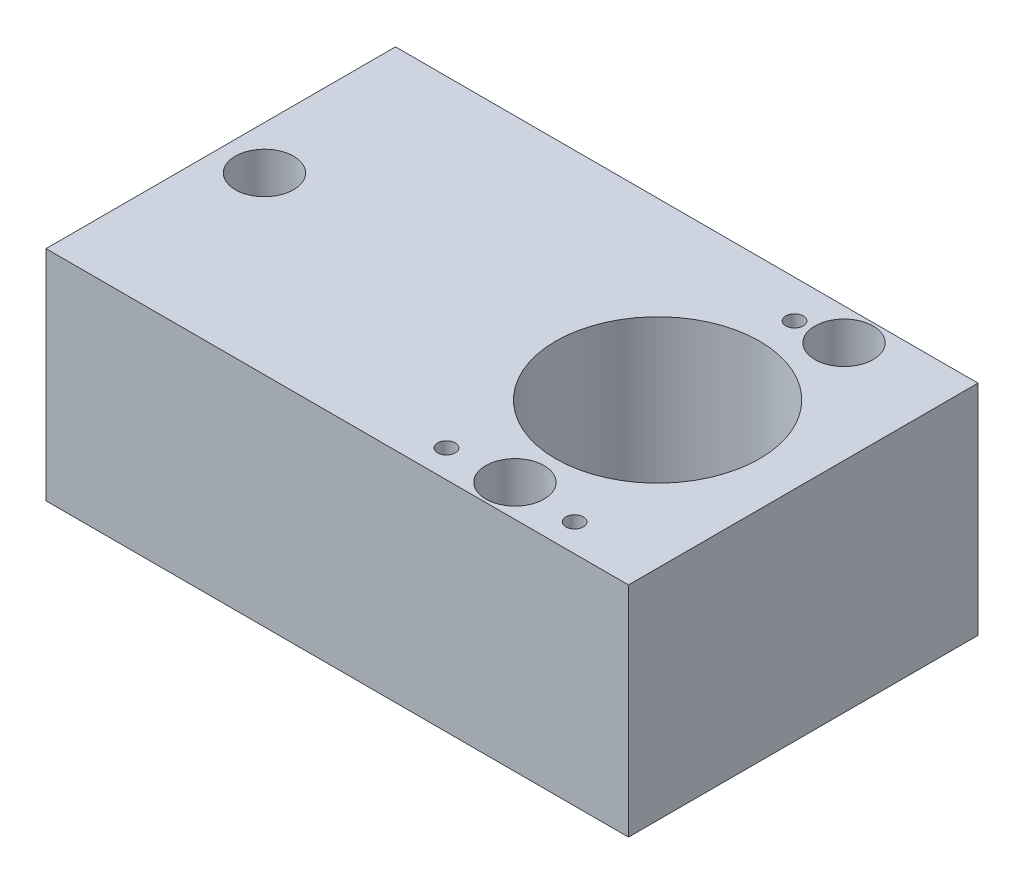
ISO-10303-21;
HEADER;
FILE_DESCRIPTION(('STEP AP214'),'2;1');
FILE_NAME('part.step','',(''),(''),'','','');
FILE_SCHEMA(('AUTOMOTIVE_DESIGN { 1 0 10303 214 1 1 1 1 }'));
ENDSEC;
DATA;
#1=APPLICATION_CONTEXT('core data for automotive mechanical design processes');
#2=APPLICATION_PROTOCOL_DEFINITION('international standard','automotive_design',2000,#1);
#3=PRODUCT_CONTEXT('',#1,'mechanical');
#4=PRODUCT('Part','Part','',(#3));
#5=PRODUCT_RELATED_PRODUCT_CATEGORY('part','',(#4));
#6=PRODUCT_DEFINITION_FORMATION('','',#4);
#7=PRODUCT_DEFINITION_CONTEXT('part definition',#1,'design');
#8=PRODUCT_DEFINITION('design','',#6,#7);
#9=PRODUCT_DEFINITION_SHAPE('','',#8);
#10=(LENGTH_UNIT() NAMED_UNIT(*) SI_UNIT(.MILLI.,.METRE.));
#11=(NAMED_UNIT(*) PLANE_ANGLE_UNIT() SI_UNIT($,.RADIAN.));
#12=(NAMED_UNIT(*) SI_UNIT($,.STERADIAN.) SOLID_ANGLE_UNIT());
#13=UNCERTAINTY_MEASURE_WITH_UNIT(LENGTH_MEASURE(1.E-05),#10,'distance_accuracy_value','');
#14=(GEOMETRIC_REPRESENTATION_CONTEXT(3) GLOBAL_UNCERTAINTY_ASSIGNED_CONTEXT((#13)) GLOBAL_UNIT_ASSIGNED_CONTEXT((#10,
#11,#12)) REPRESENTATION_CONTEXT('',''));
#15=CARTESIAN_POINT('',(0.,0.,0.));
#16=DIRECTION('',(0.,0.,1.));
#17=DIRECTION('',(1.,0.,0.));
#18=AXIS2_PLACEMENT_3D('',#15,#16,#17);
#19=CARTESIAN_POINT('',(0.,2.5,0.));
#20=DIRECTION('',(0.,-1.,0.));
#21=DIRECTION('',(0.,0.,-1.));
#22=AXIS2_PLACEMENT_3D('',#19,#20,#21);
#23=PLANE('',#22);
#24=CARTESIAN_POINT('',(15.,2.5,6.));
#25=DIRECTION('',(0.,1.,0.));
#26=DIRECTION('',(0.,0.,1.));
#27=AXIS2_PLACEMENT_3D('',#24,#25,#26);
#28=CIRCLE('',#27,2.55);
#29=CARTESIAN_POINT('',(15.,2.5,8.55));
#30=VERTEX_POINT('',#29);
#31=EDGE_CURVE('E131',#30,#30,#28,.T.);
#32=ORIENTED_EDGE('',*,*,#31,.F.);
#33=EDGE_LOOP('',(#32));
#34=FACE_BOUND('',#33,.T.);
#35=CARTESIAN_POINT('',(15.,2.5,6.));
#36=DIRECTION('',(0.,-1.,0.));
#37=DIRECTION('',(0.,0.,-1.));
#38=AXIS2_PLACEMENT_3D('',#35,#36,#37);
#39=CIRCLE('',#38,3.5);
#40=CARTESIAN_POINT('',(15.,2.5,2.5));
#41=VERTEX_POINT('',#40);
#42=EDGE_CURVE('E13',#41,#41,#39,.T.);
#43=ORIENTED_EDGE('',*,*,#42,.F.);
#44=EDGE_LOOP('',(#43));
#45=FACE_BOUND('',#44,.T.);
#46=ADVANCED_FACE('F54',(#34,#45),#23,.F.);
#47=CARTESIAN_POINT('',(0.,2.5,0.));
#48=DIRECTION('',(0.,0.,-1.));
#49=DIRECTION('',(-1.,0.,0.));
#50=AXIS2_PLACEMENT_3D('',#47,#48,#49);
#51=PLANE('',#50);
#52=DIRECTION('',(1.,0.,0.));
#53=VECTOR('',#52,1.);
#54=CARTESIAN_POINT('',(0.,0.,0.));
#55=LINE('',#54,#53);
#56=CARTESIAN_POINT('',(0.,0.,0.));
#57=VERTEX_POINT('',#56);
#58=CARTESIAN_POINT('',(20.,0.,0.));
#59=VERTEX_POINT('',#58);
#60=EDGE_CURVE('E144',#57,#59,#55,.T.);
#61=ORIENTED_EDGE('',*,*,#60,.F.);
#62=DIRECTION('',(0.,-1.,0.));
#63=VECTOR('',#62,1.);
#64=CARTESIAN_POINT('',(0.,2.5,0.));
#65=LINE('',#64,#63);
#66=CARTESIAN_POINT('',(0.,7.5,0.));
#67=VERTEX_POINT('',#66);
#68=EDGE_CURVE('E63',#67,#57,#65,.T.);
#69=ORIENTED_EDGE('',*,*,#68,.F.);
#70=DIRECTION('',(1.,0.,0.));
#71=VECTOR('',#70,1.);
#72=CARTESIAN_POINT('',(0.,7.5,0.));
#73=LINE('',#72,#71);
#74=CARTESIAN_POINT('',(20.,7.5,0.));
#75=VERTEX_POINT('',#74);
#76=EDGE_CURVE('E124',#67,#75,#73,.T.);
#77=ORIENTED_EDGE('',*,*,#76,.T.);
#78=DIRECTION('',(0.,-1.,0.));
#79=VECTOR('',#78,1.);
#80=CARTESIAN_POINT('',(20.,2.5,0.));
#81=LINE('',#80,#79);
#82=EDGE_CURVE('E105',#75,#59,#81,.T.);
#83=ORIENTED_EDGE('',*,*,#82,.T.);
#84=EDGE_LOOP('',(#61,#69,#77,#83));
#85=FACE_BOUND('',#84,.T.);
#86=ADVANCED_FACE('F56',(#85),#51,.T.);
#87=CARTESIAN_POINT('',(0.,2.5,0.));
#88=DIRECTION('',(1.,0.,0.));
#89=DIRECTION('',(0.,0.,-1.));
#90=AXIS2_PLACEMENT_3D('',#87,#88,#89);
#91=PLANE('',#90);
#92=DIRECTION('',(0.,0.,1.));
#93=VECTOR('',#92,1.);
#94=CARTESIAN_POINT('',(0.,0.,0.));
#95=LINE('',#94,#93);
#96=CARTESIAN_POINT('',(0.,0.,12.));
#97=VERTEX_POINT('',#96);
#98=EDGE_CURVE('E74',#57,#97,#95,.T.);
#99=ORIENTED_EDGE('',*,*,#98,.T.);
#100=DIRECTION('',(0.,-1.,0.));
#101=VECTOR('',#100,1.);
#102=CARTESIAN_POINT('',(0.,2.5,12.));
#103=LINE('',#102,#101);
#104=CARTESIAN_POINT('',(0.,7.5,12.));
#105=VERTEX_POINT('',#104);
#106=EDGE_CURVE('E104',#105,#97,#103,.T.);
#107=ORIENTED_EDGE('',*,*,#106,.F.);
#108=DIRECTION('',(0.,0.,1.));
#109=VECTOR('',#108,1.);
#110=CARTESIAN_POINT('',(0.,7.5,0.));
#111=LINE('',#110,#109);
#112=EDGE_CURVE('E114',#67,#105,#111,.T.);
#113=ORIENTED_EDGE('',*,*,#112,.F.);
#114=ORIENTED_EDGE('',*,*,#68,.T.);
#115=EDGE_LOOP('',(#99,#107,#113,#114));
#116=FACE_BOUND('',#115,.T.);
#117=ADVANCED_FACE('F249',(#116),#91,.F.);
#118=CARTESIAN_POINT('',(0.,2.5,12.));
#119=DIRECTION('',(0.,0.,-1.));
#120=DIRECTION('',(-1.,0.,0.));
#121=AXIS2_PLACEMENT_3D('',#118,#119,#120);
#122=PLANE('',#121);
#123=DIRECTION('',(1.,0.,0.));
#124=VECTOR('',#123,1.);
#125=CARTESIAN_POINT('',(0.,0.,12.));
#126=LINE('',#125,#124);
#127=CARTESIAN_POINT('',(20.,0.,12.));
#128=VERTEX_POINT('',#127);
#129=EDGE_CURVE('E99',#97,#128,#126,.T.);
#130=ORIENTED_EDGE('',*,*,#129,.T.);
#131=DIRECTION('',(0.,-1.,0.));
#132=VECTOR('',#131,1.);
#133=CARTESIAN_POINT('',(20.,2.5,12.));
#134=LINE('',#133,#132);
#135=CARTESIAN_POINT('',(20.,7.5,12.));
#136=VERTEX_POINT('',#135);
#137=EDGE_CURVE('E94',#136,#128,#134,.T.);
#138=ORIENTED_EDGE('',*,*,#137,.F.);
#139=DIRECTION('',(1.,0.,0.));
#140=VECTOR('',#139,1.);
#141=CARTESIAN_POINT('',(0.,7.5,12.));
#142=LINE('',#141,#140);
#143=EDGE_CURVE('E97',#105,#136,#142,.T.);
#144=ORIENTED_EDGE('',*,*,#143,.F.);
#145=ORIENTED_EDGE('',*,*,#106,.T.);
#146=EDGE_LOOP('',(#130,#138,#144,#145));
#147=FACE_BOUND('',#146,.T.);
#148=ADVANCED_FACE('F96',(#147),#122,.F.);
#149=CARTESIAN_POINT('',(20.,2.5,0.));
#150=DIRECTION('',(1.,0.,0.));
#151=DIRECTION('',(0.,0.,-1.));
#152=AXIS2_PLACEMENT_3D('',#149,#150,#151);
#153=PLANE('',#152);
#154=DIRECTION('',(0.,0.,1.));
#155=VECTOR('',#154,1.);
#156=CARTESIAN_POINT('',(20.,0.,0.));
#157=LINE('',#156,#155);
#158=EDGE_CURVE('E147',#59,#128,#157,.T.);
#159=ORIENTED_EDGE('',*,*,#158,.F.);
#160=ORIENTED_EDGE('',*,*,#82,.F.);
#161=DIRECTION('',(0.,0.,1.));
#162=VECTOR('',#161,1.);
#163=CARTESIAN_POINT('',(20.,7.5,0.));
#164=LINE('',#163,#162);
#165=EDGE_CURVE('E112',#75,#136,#164,.T.);
#166=ORIENTED_EDGE('',*,*,#165,.T.);
#167=ORIENTED_EDGE('',*,*,#137,.T.);
#168=EDGE_LOOP('',(#159,#160,#166,#167));
#169=FACE_BOUND('',#168,.T.);
#170=ADVANCED_FACE('F116',(#169),#153,.T.);
#171=CARTESIAN_POINT('',(0.,0.,0.));
#172=DIRECTION('',(0.,-1.,0.));
#173=DIRECTION('',(0.,0.,-1.));
#174=AXIS2_PLACEMENT_3D('',#171,#172,#173);
#175=PLANE('',#174);
#176=CARTESIAN_POINT('',(15.,0.,10.9));
#177=DIRECTION('',(0.,-1.,0.));
#178=DIRECTION('',(0.,0.,-1.));
#179=AXIS2_PLACEMENT_3D('',#176,#177,#178);
#180=CIRCLE('',#179,0.699999999999998);
#181=CARTESIAN_POINT('',(15.,0.,10.2));
#182=VERTEX_POINT('',#181);
#183=EDGE_CURVE('E120',#182,#182,#180,.T.);
#184=ORIENTED_EDGE('',*,*,#183,.F.);
#185=EDGE_LOOP('',(#184));
#186=FACE_BOUND('',#185,.T.);
#187=CARTESIAN_POINT('',(16.5,0.,1.1));
#188=DIRECTION('',(0.,-1.,0.));
#189=DIRECTION('',(0.,0.,-1.));
#190=AXIS2_PLACEMENT_3D('',#187,#188,#189);
#191=CIRCLE('',#190,0.699999999999998);
#192=CARTESIAN_POINT('',(16.5,0.,0.400000000000002));
#193=VERTEX_POINT('',#192);
#194=EDGE_CURVE('E166',#193,#193,#191,.T.);
#195=ORIENTED_EDGE('',*,*,#194,.F.);
#196=EDGE_LOOP('',(#195));
#197=FACE_BOUND('',#196,.T.);
#198=CARTESIAN_POINT('',(1.5,0.,6.));
#199=DIRECTION('',(0.,-1.,0.));
#200=DIRECTION('',(0.,0.,-1.));
#201=AXIS2_PLACEMENT_3D('',#198,#199,#200);
#202=CIRCLE('',#201,0.699999999999998);
#203=CARTESIAN_POINT('',(1.5,0.,5.3));
#204=VERTEX_POINT('',#203);
#205=EDGE_CURVE('E162',#204,#204,#202,.T.);
#206=ORIENTED_EDGE('',*,*,#205,.F.);
#207=EDGE_LOOP('',(#206));
#208=FACE_BOUND('',#207,.T.);
#209=CARTESIAN_POINT('',(8.34065861769801,0.,8.2));
#210=DIRECTION('',(0.,1.,0.));
#211=DIRECTION('',(0.,0.,1.));
#212=AXIS2_PLACEMENT_3D('',#209,#210,#211);
#213=CIRCLE('',#212,0.55);
#214=CARTESIAN_POINT('',(8.34065861769801,0.,8.75));
#215=VERTEX_POINT('',#214);
#216=EDGE_CURVE('E134',#215,#215,#213,.T.);
#217=ORIENTED_EDGE('',*,*,#216,.T.);
#218=EDGE_LOOP('',(#217));
#219=FACE_BOUND('',#218,.T.);
#220=CARTESIAN_POINT('',(15.,0.,6.));
#221=DIRECTION('',(0.,1.,0.));
#222=DIRECTION('',(0.,0.,1.));
#223=AXIS2_PLACEMENT_3D('',#220,#221,#222);
#224=CIRCLE('',#223,2.55);
#225=CARTESIAN_POINT('',(15.,0.,8.55));
#226=VERTEX_POINT('',#225);
#227=EDGE_CURVE('E127',#226,#226,#224,.T.);
#228=ORIENTED_EDGE('',*,*,#227,.T.);
#229=EDGE_LOOP('',(#228));
#230=FACE_BOUND('',#229,.T.);
#231=CARTESIAN_POINT('',(10.7298585496743,0.,3.80776552481034));
#232=DIRECTION('',(0.,1.,0.));
#233=DIRECTION('',(0.,0.,1.));
#234=AXIS2_PLACEMENT_3D('',#231,#232,#233);
#235=CIRCLE('',#234,0.55);
#236=CARTESIAN_POINT('',(10.7298585496743,0.,4.35776552481034));
#237=VERTEX_POINT('',#236);
#238=EDGE_CURVE('E130',#237,#237,#235,.T.);
#239=ORIENTED_EDGE('',*,*,#238,.T.);
#240=EDGE_LOOP('',(#239));
#241=FACE_BOUND('',#240,.T.);
#242=ORIENTED_EDGE('',*,*,#60,.T.);
#243=ORIENTED_EDGE('',*,*,#158,.T.);
#244=ORIENTED_EDGE('',*,*,#129,.F.);
#245=ORIENTED_EDGE('',*,*,#98,.F.);
#246=EDGE_LOOP('',(#242,#243,#244,#245));
#247=FACE_BOUND('',#246,.T.);
#248=ADVANCED_FACE('F256',(#186,#197,#208,#219,#230,#241,#247),#175,.T.);
#249=CARTESIAN_POINT('',(10.7298585496743,2.5,3.80776552481034));
#250=DIRECTION('',(0.,-1.,0.));
#251=DIRECTION('',(0.,0.,-1.));
#252=AXIS2_PLACEMENT_3D('',#249,#250,#251);
#253=CYLINDRICAL_SURFACE('',#252,0.55);
#254=CARTESIAN_POINT('',(10.7298585496743,2.5,3.80776552481034));
#255=DIRECTION('',(0.,1.,0.));
#256=DIRECTION('',(0.,0.,1.));
#257=AXIS2_PLACEMENT_3D('',#254,#255,#256);
#258=CIRCLE('',#257,0.55);
#259=CARTESIAN_POINT('',(10.7298585496743,2.5,4.35776552481034));
#260=VERTEX_POINT('',#259);
#261=EDGE_CURVE('E126',#260,#260,#258,.T.);
#262=ORIENTED_EDGE('',*,*,#261,.T.);
#263=EDGE_LOOP('',(#262));
#264=FACE_BOUND('',#263,.T.);
#265=ORIENTED_EDGE('',*,*,#238,.F.);
#266=EDGE_LOOP('',(#265));
#267=FACE_BOUND('',#266,.T.);
#268=ADVANCED_FACE('F254',(#264,#267),#253,.F.);
#269=CARTESIAN_POINT('',(15.,2.5,6.));
#270=DIRECTION('',(0.,-1.,0.));
#271=DIRECTION('',(0.,0.,-1.));
#272=AXIS2_PLACEMENT_3D('',#269,#270,#271);
#273=CYLINDRICAL_SURFACE('',#272,2.55);
#274=ORIENTED_EDGE('',*,*,#31,.T.);
#275=EDGE_LOOP('',(#274));
#276=FACE_BOUND('',#275,.T.);
#277=ORIENTED_EDGE('',*,*,#227,.F.);
#278=EDGE_LOOP('',(#277));
#279=FACE_BOUND('',#278,.T.);
#280=ADVANCED_FACE('F281',(#276,#279),#273,.F.);
#281=CARTESIAN_POINT('',(8.34065861769801,2.5,8.2));
#282=DIRECTION('',(0.,-1.,0.));
#283=DIRECTION('',(0.,0.,-1.));
#284=AXIS2_PLACEMENT_3D('',#281,#282,#283);
#285=CYLINDRICAL_SURFACE('',#284,0.55);
#286=CARTESIAN_POINT('',(8.34065861769801,2.5,8.2));
#287=DIRECTION('',(0.,1.,0.));
#288=DIRECTION('',(0.,0.,1.));
#289=AXIS2_PLACEMENT_3D('',#286,#287,#288);
#290=CIRCLE('',#289,0.55);
#291=CARTESIAN_POINT('',(8.34065861769801,2.5,8.75));
#292=VERTEX_POINT('',#291);
#293=EDGE_CURVE('E137',#292,#292,#290,.T.);
#294=ORIENTED_EDGE('',*,*,#293,.T.);
#295=EDGE_LOOP('',(#294));
#296=FACE_BOUND('',#295,.T.);
#297=ORIENTED_EDGE('',*,*,#216,.F.);
#298=EDGE_LOOP('',(#297));
#299=FACE_BOUND('',#298,.T.);
#300=ADVANCED_FACE('F239',(#296,#299),#285,.F.);
#301=CARTESIAN_POINT('',(15.,7.5,6.));
#302=DIRECTION('',(0.,-1.,0.));
#303=DIRECTION('',(0.,0.,-1.));
#304=AXIS2_PLACEMENT_3D('',#301,#302,#303);
#305=CYLINDRICAL_SURFACE('',#304,3.5);
#306=CARTESIAN_POINT('',(15.,7.5,6.));
#307=DIRECTION('',(0.,-1.,0.));
#308=DIRECTION('',(0.,0.,-1.));
#309=AXIS2_PLACEMENT_3D('',#306,#307,#308);
#310=CIRCLE('',#309,3.5);
#311=CARTESIAN_POINT('',(15.,7.5,2.5));
#312=VERTEX_POINT('',#311);
#313=EDGE_CURVE('E117',#312,#312,#310,.T.);
#314=ORIENTED_EDGE('',*,*,#313,.F.);
#315=EDGE_LOOP('',(#314));
#316=FACE_BOUND('',#315,.T.);
#317=ORIENTED_EDGE('',*,*,#42,.T.);
#318=EDGE_LOOP('',(#317));
#319=FACE_BOUND('',#318,.T.);
#320=ADVANCED_FACE('F223',(#316,#319),#305,.F.);
#321=CARTESIAN_POINT('',(0.,7.5,0.));
#322=DIRECTION('',(0.,1.,0.));
#323=DIRECTION('',(0.,0.,1.));
#324=AXIS2_PLACEMENT_3D('',#321,#322,#323);
#325=PLANE('',#324);
#326=CARTESIAN_POINT('',(12.8,7.5,11.05));
#327=DIRECTION('',(0.,1.,0.));
#328=DIRECTION('',(0.,0.,1.));
#329=AXIS2_PLACEMENT_3D('',#326,#327,#328);
#330=CIRCLE('',#329,0.3);
#331=CARTESIAN_POINT('',(12.8,7.5,11.35));
#332=VERTEX_POINT('',#331);
#333=EDGE_CURVE('E205',#332,#332,#330,.T.);
#334=ORIENTED_EDGE('',*,*,#333,.F.);
#335=EDGE_LOOP('',(#334));
#336=FACE_BOUND('',#335,.T.);
#337=CARTESIAN_POINT('',(17.2,7.5,11.05));
#338=DIRECTION('',(0.,1.,0.));
#339=DIRECTION('',(0.,0.,1.));
#340=AXIS2_PLACEMENT_3D('',#337,#338,#339);
#341=CIRCLE('',#340,0.299999999999997);
#342=CARTESIAN_POINT('',(17.2,7.5,11.35));
#343=VERTEX_POINT('',#342);
#344=EDGE_CURVE('E202',#343,#343,#341,.T.);
#345=ORIENTED_EDGE('',*,*,#344,.F.);
#346=EDGE_LOOP('',(#345));
#347=FACE_BOUND('',#346,.T.);
#348=CARTESIAN_POINT('',(15.,7.5,1.3));
#349=DIRECTION('',(0.,1.,0.));
#350=DIRECTION('',(0.,0.,1.));
#351=AXIS2_PLACEMENT_3D('',#348,#349,#350);
#352=CIRCLE('',#351,0.3);
#353=CARTESIAN_POINT('',(15.,7.5,1.6));
#354=VERTEX_POINT('',#353);
#355=EDGE_CURVE('E196',#354,#354,#352,.T.);
#356=ORIENTED_EDGE('',*,*,#355,.F.);
#357=EDGE_LOOP('',(#356));
#358=FACE_BOUND('',#357,.T.);
#359=CARTESIAN_POINT('',(15.,7.5,10.9));
#360=DIRECTION('',(0.,1.,0.));
#361=DIRECTION('',(0.,0.,1.));
#362=AXIS2_PLACEMENT_3D('',#359,#360,#361);
#363=CIRCLE('',#362,1.);
#364=CARTESIAN_POINT('',(15.,7.5,11.9));
#365=VERTEX_POINT('',#364);
#366=EDGE_CURVE('E186',#365,#365,#363,.T.);
#367=ORIENTED_EDGE('',*,*,#366,.F.);
#368=EDGE_LOOP('',(#367));
#369=FACE_BOUND('',#368,.T.);
#370=CARTESIAN_POINT('',(1.5,7.5,6.));
#371=DIRECTION('',(0.,1.,0.));
#372=DIRECTION('',(0.,0.,1.));
#373=AXIS2_PLACEMENT_3D('',#370,#371,#372);
#374=CIRCLE('',#373,1.);
#375=CARTESIAN_POINT('',(1.5,7.5,7.));
#376=VERTEX_POINT('',#375);
#377=EDGE_CURVE('E183',#376,#376,#374,.T.);
#378=ORIENTED_EDGE('',*,*,#377,.F.);
#379=EDGE_LOOP('',(#378));
#380=FACE_BOUND('',#379,.T.);
#381=CARTESIAN_POINT('',(16.5,7.5,1.1));
#382=DIRECTION('',(0.,1.,0.));
#383=DIRECTION('',(0.,0.,1.));
#384=AXIS2_PLACEMENT_3D('',#381,#382,#383);
#385=CIRCLE('',#384,1.);
#386=CARTESIAN_POINT('',(16.5,7.5,2.1));
#387=VERTEX_POINT('',#386);
#388=EDGE_CURVE('E175',#387,#387,#385,.T.);
#389=ORIENTED_EDGE('',*,*,#388,.F.);
#390=EDGE_LOOP('',(#389));
#391=FACE_BOUND('',#390,.T.);
#392=ORIENTED_EDGE('',*,*,#313,.T.);
#393=EDGE_LOOP('',(#392));
#394=FACE_BOUND('',#393,.T.);
#395=ORIENTED_EDGE('',*,*,#165,.F.);
#396=ORIENTED_EDGE('',*,*,#76,.F.);
#397=ORIENTED_EDGE('',*,*,#112,.T.);
#398=ORIENTED_EDGE('',*,*,#143,.T.);
#399=EDGE_LOOP('',(#395,#396,#397,#398));
#400=FACE_BOUND('',#399,.T.);
#401=ADVANCED_FACE('F110',(#336,#347,#358,#369,#380,#391,#394,#400),#325,.T.);
#402=CARTESIAN_POINT('',(0.,2.5,0.));
#403=DIRECTION('',(0.,1.,0.));
#404=DIRECTION('',(0.,0.,1.));
#405=AXIS2_PLACEMENT_3D('',#402,#403,#404);
#406=PLANE('',#405);
#407=ORIENTED_EDGE('',*,*,#261,.F.);
#408=EDGE_LOOP('',(#407));
#409=FACE_BOUND('',#408,.T.);
#410=ADVANCED_FACE('F222',(#409),#406,.F.);
#411=ORIENTED_EDGE('',*,*,#293,.F.);
#412=EDGE_LOOP('',(#411));
#413=FACE_BOUND('',#412,.T.);
#414=ADVANCED_FACE('F310',(#413),#406,.F.);
#415=CARTESIAN_POINT('',(1.5,7.5,6.));
#416=DIRECTION('',(0.,-1.,0.));
#417=DIRECTION('',(0.,0.,-1.));
#418=AXIS2_PLACEMENT_3D('',#415,#416,#417);
#419=CYLINDRICAL_SURFACE('',#418,0.699999999999998);
#420=CARTESIAN_POINT('',(1.5,2.,6.));
#421=DIRECTION('',(0.,-1.,0.));
#422=DIRECTION('',(0.,0.,-1.));
#423=AXIS2_PLACEMENT_3D('',#420,#421,#422);
#424=CIRCLE('',#423,0.699999999999998);
#425=CARTESIAN_POINT('',(1.5,2.,5.3));
#426=VERTEX_POINT('',#425);
#427=EDGE_CURVE('E58',#426,#426,#424,.F.);
#428=ORIENTED_EDGE('',*,*,#427,.T.);
#429=EDGE_LOOP('',(#428));
#430=FACE_BOUND('',#429,.T.);
#431=ORIENTED_EDGE('',*,*,#205,.T.);
#432=EDGE_LOOP('',(#431));
#433=FACE_BOUND('',#432,.T.);
#434=ADVANCED_FACE('F317',(#430,#433),#419,.F.);
#435=CARTESIAN_POINT('',(16.5,7.5,1.1));
#436=DIRECTION('',(0.,-1.,0.));
#437=DIRECTION('',(0.,0.,-1.));
#438=AXIS2_PLACEMENT_3D('',#435,#436,#437);
#439=CYLINDRICAL_SURFACE('',#438,0.699999999999998);
#440=CARTESIAN_POINT('',(16.5,2.,1.1));
#441=DIRECTION('',(0.,-1.,0.));
#442=DIRECTION('',(0.,0.,-1.));
#443=AXIS2_PLACEMENT_3D('',#440,#441,#442);
#444=CIRCLE('',#443,0.699999999999998);
#445=CARTESIAN_POINT('',(16.5,2.,0.400000000000002));
#446=VERTEX_POINT('',#445);
#447=EDGE_CURVE('E156',#446,#446,#444,.F.);
#448=ORIENTED_EDGE('',*,*,#447,.T.);
#449=EDGE_LOOP('',(#448));
#450=FACE_BOUND('',#449,.T.);
#451=ORIENTED_EDGE('',*,*,#194,.T.);
#452=EDGE_LOOP('',(#451));
#453=FACE_BOUND('',#452,.T.);
#454=ADVANCED_FACE('F323',(#450,#453),#439,.F.);
#455=CARTESIAN_POINT('',(15.,7.5,10.9));
#456=DIRECTION('',(0.,-1.,0.));
#457=DIRECTION('',(0.,0.,-1.));
#458=AXIS2_PLACEMENT_3D('',#455,#456,#457);
#459=CYLINDRICAL_SURFACE('',#458,0.699999999999998);
#460=CARTESIAN_POINT('',(15.,2.,10.9));
#461=DIRECTION('',(0.,-1.,0.));
#462=DIRECTION('',(0.,0.,-1.));
#463=AXIS2_PLACEMENT_3D('',#460,#461,#462);
#464=CIRCLE('',#463,0.699999999999998);
#465=CARTESIAN_POINT('',(15.,2.,10.2));
#466=VERTEX_POINT('',#465);
#467=EDGE_CURVE('E154',#466,#466,#464,.F.);
#468=ORIENTED_EDGE('',*,*,#467,.T.);
#469=EDGE_LOOP('',(#468));
#470=FACE_BOUND('',#469,.T.);
#471=ORIENTED_EDGE('',*,*,#183,.T.);
#472=EDGE_LOOP('',(#471));
#473=FACE_BOUND('',#472,.T.);
#474=ADVANCED_FACE('F330',(#470,#473),#459,.F.);
#475=CARTESIAN_POINT('',(0.,2.,0.));
#476=DIRECTION('',(0.,-1.,0.));
#477=DIRECTION('',(0.,0.,-1.));
#478=AXIS2_PLACEMENT_3D('',#475,#476,#477);
#479=PLANE('',#478);
#480=CARTESIAN_POINT('',(15.,2.,10.9));
#481=DIRECTION('',(0.,-1.,0.));
#482=DIRECTION('',(0.,0.,-1.));
#483=AXIS2_PLACEMENT_3D('',#480,#481,#482);
#484=CIRCLE('',#483,1.);
#485=CARTESIAN_POINT('',(15.,2.,9.9));
#486=VERTEX_POINT('',#485);
#487=EDGE_CURVE('E157',#486,#486,#484,.F.);
#488=ORIENTED_EDGE('',*,*,#487,.T.);
#489=EDGE_LOOP('',(#488));
#490=FACE_BOUND('',#489,.T.);
#491=ORIENTED_EDGE('',*,*,#467,.F.);
#492=EDGE_LOOP('',(#491));
#493=FACE_BOUND('',#492,.T.);
#494=ADVANCED_FACE('F337',(#490,#493),#479,.F.);
#495=CARTESIAN_POINT('',(15.,-2.8284271247462,10.9));
#496=DIRECTION('',(0.,1.,0.));
#497=DIRECTION('',(0.,0.,1.));
#498=AXIS2_PLACEMENT_3D('',#495,#496,#497);
#499=CYLINDRICAL_SURFACE('',#498,1.);
#500=ORIENTED_EDGE('',*,*,#366,.T.);
#501=EDGE_LOOP('',(#500));
#502=FACE_BOUND('',#501,.T.);
#503=ORIENTED_EDGE('',*,*,#487,.F.);
#504=EDGE_LOOP('',(#503));
#505=FACE_BOUND('',#504,.T.);
#506=ADVANCED_FACE('F345',(#502,#505),#499,.F.);
#507=CARTESIAN_POINT('',(0.,2.,0.));
#508=DIRECTION('',(0.,-1.,0.));
#509=DIRECTION('',(0.,0.,-1.));
#510=AXIS2_PLACEMENT_3D('',#507,#508,#509);
#511=PLANE('',#510);
#512=CARTESIAN_POINT('',(16.5,2.,1.1));
#513=DIRECTION('',(0.,-1.,0.));
#514=DIRECTION('',(0.,0.,-1.));
#515=AXIS2_PLACEMENT_3D('',#512,#513,#514);
#516=CIRCLE('',#515,1.);
#517=CARTESIAN_POINT('',(16.5,2.,0.0999999999999987));
#518=VERTEX_POINT('',#517);
#519=EDGE_CURVE('E179',#518,#518,#516,.F.);
#520=ORIENTED_EDGE('',*,*,#519,.T.);
#521=EDGE_LOOP('',(#520));
#522=FACE_BOUND('',#521,.T.);
#523=ORIENTED_EDGE('',*,*,#447,.F.);
#524=EDGE_LOOP('',(#523));
#525=FACE_BOUND('',#524,.T.);
#526=ADVANCED_FACE('F353',(#522,#525),#511,.F.);
#527=CARTESIAN_POINT('',(16.5,-2.8284271247462,1.1));
#528=DIRECTION('',(0.,1.,0.));
#529=DIRECTION('',(0.,0.,1.));
#530=AXIS2_PLACEMENT_3D('',#527,#528,#529);
#531=CYLINDRICAL_SURFACE('',#530,1.);
#532=ORIENTED_EDGE('',*,*,#388,.T.);
#533=EDGE_LOOP('',(#532));
#534=FACE_BOUND('',#533,.T.);
#535=ORIENTED_EDGE('',*,*,#519,.F.);
#536=EDGE_LOOP('',(#535));
#537=FACE_BOUND('',#536,.T.);
#538=ADVANCED_FACE('F361',(#534,#537),#531,.F.);
#539=CARTESIAN_POINT('',(0.,2.,0.));
#540=DIRECTION('',(0.,-1.,0.));
#541=DIRECTION('',(0.,0.,-1.));
#542=AXIS2_PLACEMENT_3D('',#539,#540,#541);
#543=PLANE('',#542);
#544=CARTESIAN_POINT('',(1.5,2.,6.));
#545=DIRECTION('',(0.,-1.,0.));
#546=DIRECTION('',(0.,0.,-1.));
#547=AXIS2_PLACEMENT_3D('',#544,#545,#546);
#548=CIRCLE('',#547,1.);
#549=CARTESIAN_POINT('',(1.5,2.,5.));
#550=VERTEX_POINT('',#549);
#551=EDGE_CURVE('E178',#550,#550,#548,.F.);
#552=ORIENTED_EDGE('',*,*,#551,.T.);
#553=EDGE_LOOP('',(#552));
#554=FACE_BOUND('',#553,.T.);
#555=ORIENTED_EDGE('',*,*,#427,.F.);
#556=EDGE_LOOP('',(#555));
#557=FACE_BOUND('',#556,.T.);
#558=ADVANCED_FACE('F369',(#554,#557),#543,.F.);
#559=CARTESIAN_POINT('',(1.5,-2.8284271247462,6.));
#560=DIRECTION('',(0.,1.,0.));
#561=DIRECTION('',(0.,0.,1.));
#562=AXIS2_PLACEMENT_3D('',#559,#560,#561);
#563=CYLINDRICAL_SURFACE('',#562,1.);
#564=ORIENTED_EDGE('',*,*,#377,.T.);
#565=EDGE_LOOP('',(#564));
#566=FACE_BOUND('',#565,.T.);
#567=ORIENTED_EDGE('',*,*,#551,.F.);
#568=EDGE_LOOP('',(#567));
#569=FACE_BOUND('',#568,.T.);
#570=ADVANCED_FACE('F377',(#566,#569),#563,.F.);
#571=CARTESIAN_POINT('',(15.,1.5,1.3));
#572=DIRECTION('',(0.,1.,0.));
#573=DIRECTION('',(0.,0.,1.));
#574=AXIS2_PLACEMENT_3D('',#571,#572,#573);
#575=CYLINDRICAL_SURFACE('',#574,0.3);
#576=CARTESIAN_POINT('',(15.,1.5,1.3));
#577=DIRECTION('',(0.,1.,0.));
#578=DIRECTION('',(0.,0.,1.));
#579=AXIS2_PLACEMENT_3D('',#576,#577,#578);
#580=CIRCLE('',#579,0.3);
#581=CARTESIAN_POINT('',(15.,1.5,1.6));
#582=VERTEX_POINT('',#581);
#583=EDGE_CURVE('E193',#582,#582,#580,.T.);
#584=ORIENTED_EDGE('',*,*,#583,.F.);
#585=EDGE_LOOP('',(#584));
#586=FACE_BOUND('',#585,.T.);
#587=ORIENTED_EDGE('',*,*,#355,.T.);
#588=EDGE_LOOP('',(#587));
#589=FACE_BOUND('',#588,.T.);
#590=ADVANCED_FACE('F384',(#586,#589),#575,.F.);
#591=CARTESIAN_POINT('',(15.,1.5,1.3));
#592=DIRECTION('',(0.,1.,0.));
#593=DIRECTION('',(0.,0.,1.));
#594=AXIS2_PLACEMENT_3D('',#591,#592,#593);
#595=PLANE('',#594);
#596=ORIENTED_EDGE('',*,*,#583,.T.);
#597=EDGE_LOOP('',(#596));
#598=FACE_BOUND('',#597,.T.);
#599=ADVANCED_FACE('F391',(#598),#595,.T.);
#600=CARTESIAN_POINT('',(17.2,1.5,11.05));
#601=DIRECTION('',(0.,1.,0.));
#602=DIRECTION('',(0.,0.,1.));
#603=AXIS2_PLACEMENT_3D('',#600,#601,#602);
#604=CYLINDRICAL_SURFACE('',#603,0.299999999999997);
#605=CARTESIAN_POINT('',(17.2,1.5,11.05));
#606=DIRECTION('',(0.,1.,0.));
#607=DIRECTION('',(0.,0.,1.));
#608=AXIS2_PLACEMENT_3D('',#605,#606,#607);
#609=CIRCLE('',#608,0.299999999999997);
#610=CARTESIAN_POINT('',(17.2,1.5,11.35));
#611=VERTEX_POINT('',#610);
#612=EDGE_CURVE('E199',#611,#611,#609,.T.);
#613=ORIENTED_EDGE('',*,*,#612,.F.);
#614=EDGE_LOOP('',(#613));
#615=FACE_BOUND('',#614,.T.);
#616=ORIENTED_EDGE('',*,*,#344,.T.);
#617=EDGE_LOOP('',(#616));
#618=FACE_BOUND('',#617,.T.);
#619=ADVANCED_FACE('F399',(#615,#618),#604,.F.);
#620=CARTESIAN_POINT('',(17.2,1.5,11.05));
#621=DIRECTION('',(0.,1.,0.));
#622=DIRECTION('',(0.,0.,1.));
#623=AXIS2_PLACEMENT_3D('',#620,#621,#622);
#624=PLANE('',#623);
#625=ORIENTED_EDGE('',*,*,#612,.T.);
#626=EDGE_LOOP('',(#625));
#627=FACE_BOUND('',#626,.T.);
#628=ADVANCED_FACE('F216',(#627),#624,.T.);
#629=CARTESIAN_POINT('',(12.8,1.5,11.05));
#630=DIRECTION('',(0.,1.,0.));
#631=DIRECTION('',(0.,0.,1.));
#632=AXIS2_PLACEMENT_3D('',#629,#630,#631);
#633=CYLINDRICAL_SURFACE('',#632,0.3);
#634=CARTESIAN_POINT('',(12.8,1.5,11.05));
#635=DIRECTION('',(0.,1.,0.));
#636=DIRECTION('',(0.,0.,1.));
#637=AXIS2_PLACEMENT_3D('',#634,#635,#636);
#638=CIRCLE('',#637,0.3);
#639=CARTESIAN_POINT('',(12.8,1.5,11.35));
#640=VERTEX_POINT('',#639);
#641=EDGE_CURVE('E182',#640,#640,#638,.T.);
#642=ORIENTED_EDGE('',*,*,#641,.F.);
#643=EDGE_LOOP('',(#642));
#644=FACE_BOUND('',#643,.T.);
#645=ORIENTED_EDGE('',*,*,#333,.T.);
#646=EDGE_LOOP('',(#645));
#647=FACE_BOUND('',#646,.T.);
#648=ADVANCED_FACE('F213',(#644,#647),#633,.F.);
#649=CARTESIAN_POINT('',(12.8,1.5,11.05));
#650=DIRECTION('',(0.,1.,0.));
#651=DIRECTION('',(0.,0.,1.));
#652=AXIS2_PLACEMENT_3D('',#649,#650,#651);
#653=PLANE('',#652);
#654=ORIENTED_EDGE('',*,*,#641,.T.);
#655=EDGE_LOOP('',(#654));
#656=FACE_BOUND('',#655,.T.);
#657=ADVANCED_FACE('F211',(#656),#653,.T.);
#658=CLOSED_SHELL('',(#46,#86,#117,#148,#170,#248,#268,#280,#300,#320,#401,#410,#414,#434,#454,
#474,#494,#506,#526,#538,#558,#570,#590,#599,#619,#628,#648,#657));
#659=MANIFOLD_SOLID_BREP('B2',#658);
#660=ADVANCED_BREP_SHAPE_REPRESENTATION('',(#18,#659),#14);
#661=SHAPE_DEFINITION_REPRESENTATION(#9,#660);
ENDSEC;
END-ISO-10303-21;
